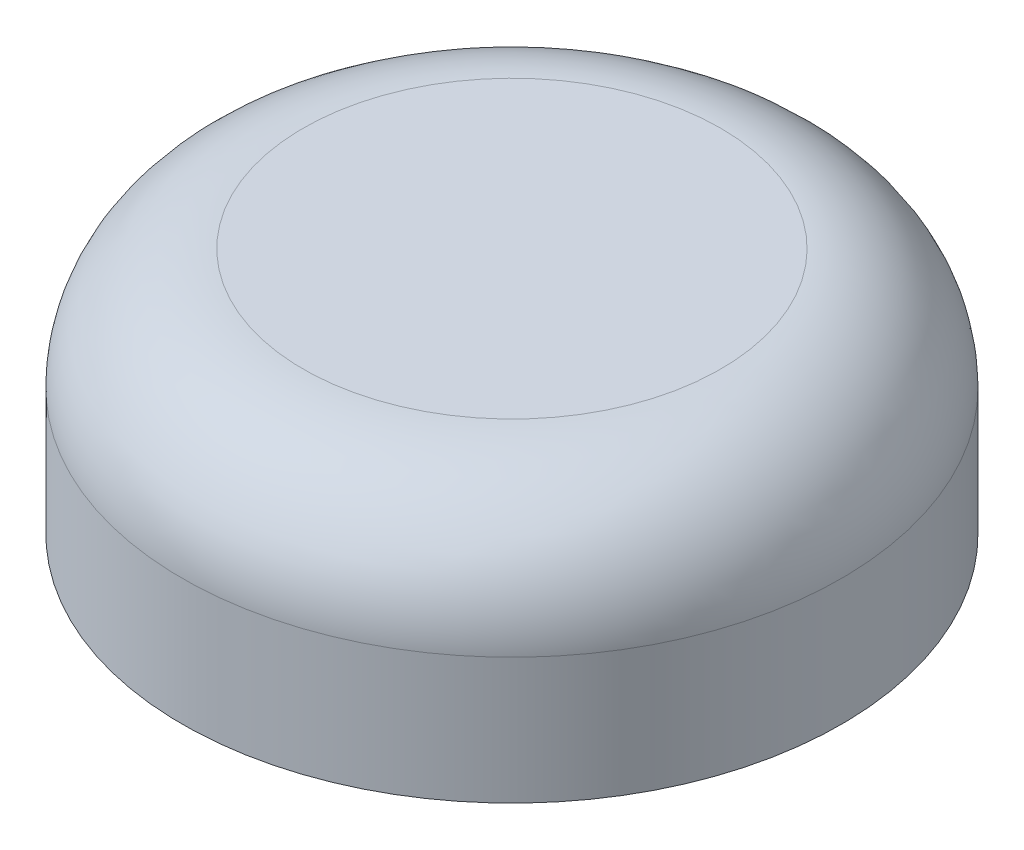
ISO-10303-21;
HEADER;
FILE_DESCRIPTION(('STEP AP214'),'2;1');
FILE_NAME('part.step','',(''),(''),'','','');
FILE_SCHEMA(('AUTOMOTIVE_DESIGN { 1 0 10303 214 1 1 1 1 }'));
ENDSEC;
DATA;
#1=APPLICATION_CONTEXT('core data for automotive mechanical design processes');
#2=APPLICATION_PROTOCOL_DEFINITION('international standard','automotive_design',2000,#1);
#3=PRODUCT_CONTEXT('',#1,'mechanical');
#4=PRODUCT('Part','Part','',(#3));
#5=PRODUCT_RELATED_PRODUCT_CATEGORY('part','',(#4));
#6=PRODUCT_DEFINITION_FORMATION('','',#4);
#7=PRODUCT_DEFINITION_CONTEXT('part definition',#1,'design');
#8=PRODUCT_DEFINITION('design','',#6,#7);
#9=PRODUCT_DEFINITION_SHAPE('','',#8);
#10=(LENGTH_UNIT() NAMED_UNIT(*) SI_UNIT(.MILLI.,.METRE.));
#11=(NAMED_UNIT(*) PLANE_ANGLE_UNIT() SI_UNIT($,.RADIAN.));
#12=(NAMED_UNIT(*) SI_UNIT($,.STERADIAN.) SOLID_ANGLE_UNIT());
#13=UNCERTAINTY_MEASURE_WITH_UNIT(LENGTH_MEASURE(1.E-05),#10,'distance_accuracy_value','');
#14=(GEOMETRIC_REPRESENTATION_CONTEXT(3) GLOBAL_UNCERTAINTY_ASSIGNED_CONTEXT((#13)) GLOBAL_UNIT_ASSIGNED_CONTEXT((#10,
#11,#12)) REPRESENTATION_CONTEXT('',''));
#15=CARTESIAN_POINT('',(0.,0.,0.));
#16=DIRECTION('',(0.,0.,1.));
#17=DIRECTION('',(1.,0.,0.));
#18=AXIS2_PLACEMENT_3D('',#15,#16,#17);
#19=CARTESIAN_POINT('',(0.,5.08,0.));
#20=DIRECTION('',(0.,-1.,0.));
#21=DIRECTION('',(0.,0.,-1.));
#22=AXIS2_PLACEMENT_3D('',#19,#20,#21);
#23=PLANE('',#22);
#24=CARTESIAN_POINT('',(0.,5.08,0.));
#25=DIRECTION('',(0.,-1.,0.));
#26=DIRECTION('',(0.,0.,-1.));
#27=AXIS2_PLACEMENT_3D('',#24,#25,#26);
#28=CIRCLE('',#27,24.13);
#29=CARTESIAN_POINT('',(0.,5.08,-24.13));
#30=VERTEX_POINT('',#29);
#31=EDGE_CURVE('E10',#30,#30,#28,.T.);
#32=ORIENTED_EDGE('',*,*,#31,.F.);
#33=EDGE_LOOP('',(#32));
#34=FACE_BOUND('',#33,.T.);
#35=ADVANCED_FACE('F35',(#34),#23,.F.);
#36=CARTESIAN_POINT('',(0.,-8.89,0.));
#37=DIRECTION('',(0.,-1.,0.));
#38=DIRECTION('',(0.,0.,-1.));
#39=AXIS2_PLACEMENT_3D('',#36,#37,#38);
#40=TOROIDAL_SURFACE('',#39,24.13,13.97);
#41=CARTESIAN_POINT('',(0.,-8.89,0.));
#42=DIRECTION('',(0.,-1.,0.));
#43=DIRECTION('',(0.,0.,-1.));
#44=AXIS2_PLACEMENT_3D('',#41,#42,#43);
#45=CIRCLE('',#44,38.1);
#46=CARTESIAN_POINT('',(0.,-8.89,-38.1));
#47=VERTEX_POINT('',#46);
#48=EDGE_CURVE('E41',#47,#47,#45,.T.);
#49=ORIENTED_EDGE('',*,*,#48,.F.);
#50=EDGE_LOOP('',(#49));
#51=FACE_BOUND('',#50,.T.);
#52=ORIENTED_EDGE('',*,*,#31,.T.);
#53=EDGE_LOOP('',(#52));
#54=FACE_BOUND('',#53,.T.);
#55=ADVANCED_FACE('F101',(#51,#54),#40,.T.);
#56=CARTESIAN_POINT('',(0.,0.,0.));
#57=DIRECTION('',(0.,-1.,0.));
#58=DIRECTION('',(0.,0.,-1.));
#59=AXIS2_PLACEMENT_3D('',#56,#57,#58);
#60=CYLINDRICAL_SURFACE('',#59,38.1);
#61=CARTESIAN_POINT('',(0.,-23.495,0.));
#62=DIRECTION('',(0.,-1.,0.));
#63=DIRECTION('',(0.,0.,-1.));
#64=AXIS2_PLACEMENT_3D('',#61,#62,#63);
#65=CIRCLE('',#64,38.1);
#66=CARTESIAN_POINT('',(0.,-23.495,-38.1));
#67=VERTEX_POINT('',#66);
#68=EDGE_CURVE('E45',#67,#67,#65,.T.);
#69=ORIENTED_EDGE('',*,*,#68,.F.);
#70=EDGE_LOOP('',(#69));
#71=FACE_BOUND('',#70,.T.);
#72=ORIENTED_EDGE('',*,*,#48,.T.);
#73=EDGE_LOOP('',(#72));
#74=FACE_BOUND('',#73,.T.);
#75=ADVANCED_FACE('F96',(#71,#74),#60,.T.);
#76=CARTESIAN_POINT('',(-35.56,-23.495,0.));
#77=DIRECTION('',(0.,1.,0.));
#78=DIRECTION('',(0.,0.,1.));
#79=AXIS2_PLACEMENT_3D('',#76,#77,#78);
#80=PLANE('',#79);
#81=CARTESIAN_POINT('',(0.,-23.495,0.));
#82=DIRECTION('',(0.,-1.,0.));
#83=DIRECTION('',(0.,0.,-1.));
#84=AXIS2_PLACEMENT_3D('',#81,#82,#83);
#85=CIRCLE('',#84,35.56);
#86=CARTESIAN_POINT('',(0.,-23.495,-35.56));
#87=VERTEX_POINT('',#86);
#88=EDGE_CURVE('E49',#87,#87,#85,.T.);
#89=ORIENTED_EDGE('',*,*,#88,.F.);
#90=EDGE_LOOP('',(#89));
#91=FACE_BOUND('',#90,.T.);
#92=ORIENTED_EDGE('',*,*,#68,.T.);
#93=EDGE_LOOP('',(#92));
#94=FACE_BOUND('',#93,.T.);
#95=ADVANCED_FACE('F90',(#91,#94),#80,.F.);
#96=CARTESIAN_POINT('',(0.,0.,0.));
#97=DIRECTION('',(0.,-1.,0.));
#98=DIRECTION('',(0.,0.,-1.));
#99=AXIS2_PLACEMENT_3D('',#96,#97,#98);
#100=CYLINDRICAL_SURFACE('',#99,35.56);
#101=CARTESIAN_POINT('',(0.,-10.795,0.));
#102=DIRECTION('',(0.,-1.,0.));
#103=DIRECTION('',(0.,0.,-1.));
#104=AXIS2_PLACEMENT_3D('',#101,#102,#103);
#105=CIRCLE('',#104,35.56);
#106=CARTESIAN_POINT('',(0.,-10.795,-35.56));
#107=VERTEX_POINT('',#106);
#108=EDGE_CURVE('E54',#107,#107,#105,.T.);
#109=ORIENTED_EDGE('',*,*,#108,.F.);
#110=EDGE_LOOP('',(#109));
#111=FACE_BOUND('',#110,.T.);
#112=ORIENTED_EDGE('',*,*,#88,.T.);
#113=EDGE_LOOP('',(#112));
#114=FACE_BOUND('',#113,.T.);
#115=ADVANCED_FACE('F84',(#111,#114),#100,.F.);
#116=CARTESIAN_POINT('',(-33.02,-10.795,0.));
#117=DIRECTION('',(0.,1.,0.));
#118=DIRECTION('',(0.,0.,1.));
#119=AXIS2_PLACEMENT_3D('',#116,#117,#118);
#120=PLANE('',#119);
#121=CARTESIAN_POINT('',(0.,-10.795,0.));
#122=DIRECTION('',(0.,-1.,0.));
#123=DIRECTION('',(0.,0.,-1.));
#124=AXIS2_PLACEMENT_3D('',#121,#122,#123);
#125=CIRCLE('',#124,33.02);
#126=CARTESIAN_POINT('',(0.,-10.795,-33.02));
#127=VERTEX_POINT('',#126);
#128=EDGE_CURVE('E57',#127,#127,#125,.T.);
#129=ORIENTED_EDGE('',*,*,#128,.F.);
#130=EDGE_LOOP('',(#129));
#131=FACE_BOUND('',#130,.T.);
#132=ORIENTED_EDGE('',*,*,#108,.T.);
#133=EDGE_LOOP('',(#132));
#134=FACE_BOUND('',#133,.T.);
#135=ADVANCED_FACE('F78',(#131,#134),#120,.F.);
#136=CARTESIAN_POINT('',(0.,0.,0.));
#137=DIRECTION('',(0.,-1.,0.));
#138=DIRECTION('',(0.,0.,-1.));
#139=AXIS2_PLACEMENT_3D('',#136,#137,#138);
#140=CYLINDRICAL_SURFACE('',#139,33.02);
#141=CARTESIAN_POINT('',(0.,-8.89,0.));
#142=DIRECTION('',(0.,-1.,0.));
#143=DIRECTION('',(0.,0.,-1.));
#144=AXIS2_PLACEMENT_3D('',#141,#142,#143);
#145=CIRCLE('',#144,33.02);
#146=CARTESIAN_POINT('',(0.,-8.89,-33.02));
#147=VERTEX_POINT('',#146);
#148=EDGE_CURVE('E60',#147,#147,#145,.T.);
#149=ORIENTED_EDGE('',*,*,#148,.F.);
#150=EDGE_LOOP('',(#149));
#151=FACE_BOUND('',#150,.T.);
#152=ORIENTED_EDGE('',*,*,#128,.T.);
#153=EDGE_LOOP('',(#152));
#154=FACE_BOUND('',#153,.T.);
#155=ADVANCED_FACE('F72',(#151,#154),#140,.F.);
#156=CARTESIAN_POINT('',(0.,-8.89,0.));
#157=DIRECTION('',(0.,-1.,0.));
#158=DIRECTION('',(0.,0.,-1.));
#159=AXIS2_PLACEMENT_3D('',#156,#157,#158);
#160=TOROIDAL_SURFACE('',#159,24.13,8.89);
#161=CARTESIAN_POINT('',(0.,0.,0.));
#162=DIRECTION('',(0.,-1.,0.));
#163=DIRECTION('',(0.,0.,-1.));
#164=AXIS2_PLACEMENT_3D('',#161,#162,#163);
#165=CIRCLE('',#164,24.13);
#166=CARTESIAN_POINT('',(0.,0.,-24.13));
#167=VERTEX_POINT('',#166);
#168=EDGE_CURVE('E63',#167,#167,#165,.T.);
#169=ORIENTED_EDGE('',*,*,#168,.F.);
#170=EDGE_LOOP('',(#169));
#171=FACE_BOUND('',#170,.T.);
#172=ORIENTED_EDGE('',*,*,#148,.T.);
#173=EDGE_LOOP('',(#172));
#174=FACE_BOUND('',#173,.T.);
#175=ADVANCED_FACE('F69',(#171,#174),#160,.F.);
#176=CARTESIAN_POINT('',(0.,0.,0.));
#177=DIRECTION('',(0.,1.,0.));
#178=DIRECTION('',(0.,0.,1.));
#179=AXIS2_PLACEMENT_3D('',#176,#177,#178);
#180=PLANE('',#179);
#181=ORIENTED_EDGE('',*,*,#168,.T.);
#182=EDGE_LOOP('',(#181));
#183=FACE_BOUND('',#182,.T.);
#184=ADVANCED_FACE('F67',(#183),#180,.F.);
#185=CLOSED_SHELL('',(#35,#55,#75,#95,#115,#135,#155,#175,#184));
#186=MANIFOLD_SOLID_BREP('B2',#185);
#187=ADVANCED_BREP_SHAPE_REPRESENTATION('',(#18,#186),#14);
#188=SHAPE_DEFINITION_REPRESENTATION(#9,#187);
ENDSEC;
END-ISO-10303-21;
